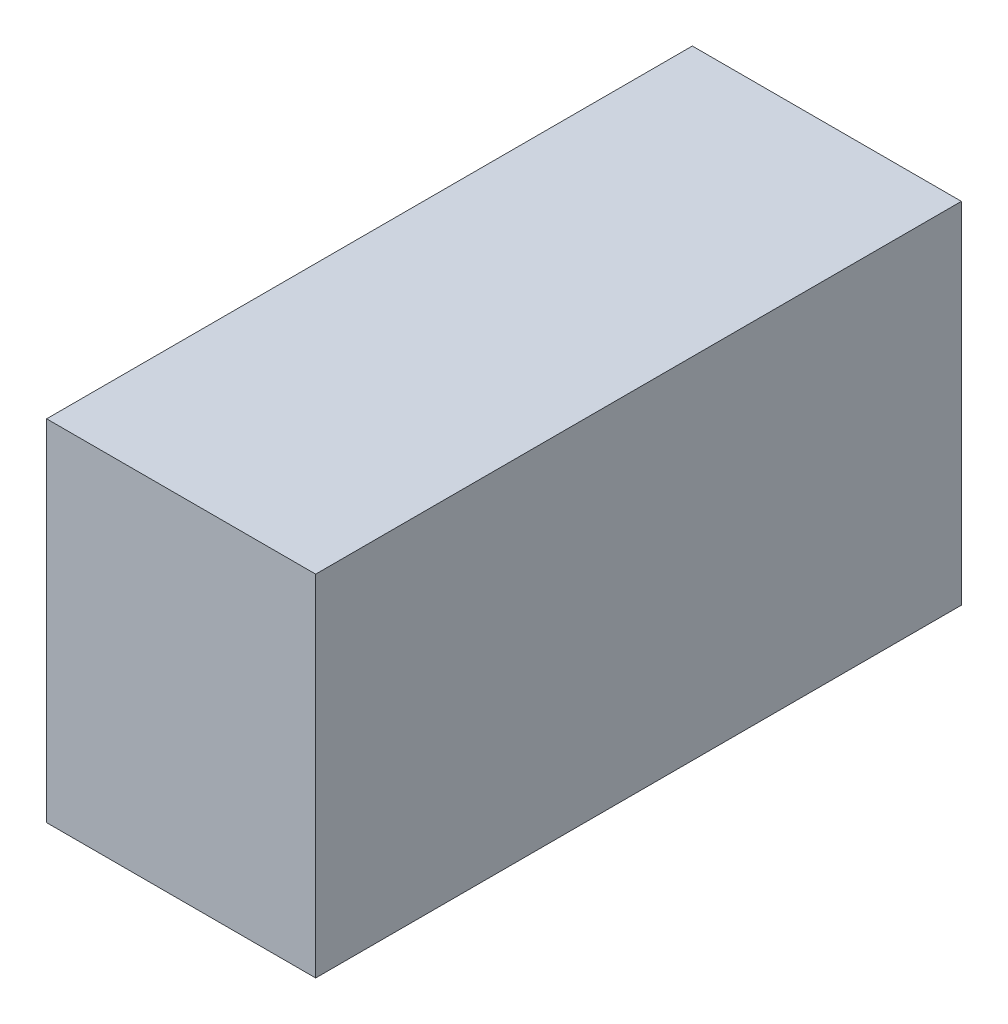
ISO-10303-21;
HEADER;
FILE_DESCRIPTION(('STEP AP214'),'2;1');
FILE_NAME('part.step','',(''),(''),'','','');
FILE_SCHEMA(('AUTOMOTIVE_DESIGN { 1 0 10303 214 1 1 1 1 }'));
ENDSEC;
DATA;
#1=APPLICATION_CONTEXT('core data for automotive mechanical design processes');
#2=APPLICATION_PROTOCOL_DEFINITION('international standard','automotive_design',2000,#1);
#3=PRODUCT_CONTEXT('',#1,'mechanical');
#4=PRODUCT('Part','Part','',(#3));
#5=PRODUCT_RELATED_PRODUCT_CATEGORY('part','',(#4));
#6=PRODUCT_DEFINITION_FORMATION('','',#4);
#7=PRODUCT_DEFINITION_CONTEXT('part definition',#1,'design');
#8=PRODUCT_DEFINITION('design','',#6,#7);
#9=PRODUCT_DEFINITION_SHAPE('','',#8);
#10=(LENGTH_UNIT() NAMED_UNIT(*) SI_UNIT(.MILLI.,.METRE.));
#11=(NAMED_UNIT(*) PLANE_ANGLE_UNIT() SI_UNIT($,.RADIAN.));
#12=(NAMED_UNIT(*) SI_UNIT($,.STERADIAN.) SOLID_ANGLE_UNIT());
#13=UNCERTAINTY_MEASURE_WITH_UNIT(LENGTH_MEASURE(1.E-05),#10,'distance_accuracy_value','');
#14=(GEOMETRIC_REPRESENTATION_CONTEXT(3) GLOBAL_UNCERTAINTY_ASSIGNED_CONTEXT((#13)) GLOBAL_UNIT_ASSIGNED_CONTEXT((#10,
#11,#12)) REPRESENTATION_CONTEXT('',''));
#15=CARTESIAN_POINT('',(0.,0.,0.));
#16=DIRECTION('',(0.,0.,1.));
#17=DIRECTION('',(1.,0.,0.));
#18=AXIS2_PLACEMENT_3D('',#15,#16,#17);
#19=CARTESIAN_POINT('',(0.,16.51,0.));
#20=DIRECTION('',(-1.,0.,0.));
#21=DIRECTION('',(0.,0.,1.));
#22=AXIS2_PLACEMENT_3D('',#19,#20,#21);
#23=PLANE('',#22);
#24=DIRECTION('',(0.,-1.,0.));
#25=VECTOR('',#24,1.);
#26=CARTESIAN_POINT('',(0.,16.51,-24.1299999999999));
#27=LINE('',#26,#25);
#28=CARTESIAN_POINT('',(0.,16.51,-24.1299999999999));
#29=VERTEX_POINT('',#28);
#30=CARTESIAN_POINT('',(0.,0.,-24.1299999999999));
#31=VERTEX_POINT('',#30);
#32=EDGE_CURVE('E56',#29,#31,#27,.T.);
#33=ORIENTED_EDGE('',*,*,#32,.F.);
#34=DIRECTION('',(0.,0.,-1.));
#35=VECTOR('',#34,1.);
#36=CARTESIAN_POINT('',(0.,16.51,0.));
#37=LINE('',#36,#35);
#38=CARTESIAN_POINT('',(0.,16.51,6.35));
#39=VERTEX_POINT('',#38);
#40=EDGE_CURVE('E82',#39,#29,#37,.T.);
#41=ORIENTED_EDGE('',*,*,#40,.F.);
#42=DIRECTION('',(0.,1.,0.));
#43=VECTOR('',#42,1.);
#44=CARTESIAN_POINT('',(0.,16.51,6.35));
#45=LINE('',#44,#43);
#46=CARTESIAN_POINT('',(0.,0.,6.35));
#47=VERTEX_POINT('',#46);
#48=EDGE_CURVE('E91',#47,#39,#45,.T.);
#49=ORIENTED_EDGE('',*,*,#48,.F.);
#50=DIRECTION('',(0.,0.,-1.));
#51=VECTOR('',#50,1.);
#52=CARTESIAN_POINT('',(0.,0.,0.));
#53=LINE('',#52,#51);
#54=EDGE_CURVE('E83',#47,#31,#53,.T.);
#55=ORIENTED_EDGE('',*,*,#54,.T.);
#56=EDGE_LOOP('',(#33,#41,#49,#55));
#57=FACE_BOUND('',#56,.T.);
#58=ADVANCED_FACE('F34',(#57),#23,.F.);
#59=CARTESIAN_POINT('',(-12.7,16.51,0.));
#60=DIRECTION('',(1.,0.,0.));
#61=DIRECTION('',(0.,0.,-1.));
#62=AXIS2_PLACEMENT_3D('',#59,#60,#61);
#63=PLANE('',#62);
#64=DIRECTION('',(0.,1.,0.));
#65=VECTOR('',#64,1.);
#66=CARTESIAN_POINT('',(-12.7,16.51,-24.1299999999999));
#67=LINE('',#66,#65);
#68=CARTESIAN_POINT('',(-12.7,0.,-24.1299999999999));
#69=VERTEX_POINT('',#68);
#70=CARTESIAN_POINT('',(-12.7,16.51,-24.1299999999999));
#71=VERTEX_POINT('',#70);
#72=EDGE_CURVE('E85',#69,#71,#67,.T.);
#73=ORIENTED_EDGE('',*,*,#72,.F.);
#74=DIRECTION('',(0.,0.,1.));
#75=VECTOR('',#74,1.);
#76=CARTESIAN_POINT('',(-12.7,0.,0.));
#77=LINE('',#76,#75);
#78=CARTESIAN_POINT('',(-12.7,0.,6.35));
#79=VERTEX_POINT('',#78);
#80=EDGE_CURVE('E74',#69,#79,#77,.T.);
#81=ORIENTED_EDGE('',*,*,#80,.T.);
#82=DIRECTION('',(0.,-1.,0.));
#83=VECTOR('',#82,1.);
#84=CARTESIAN_POINT('',(-12.7,16.51,6.35));
#85=LINE('',#84,#83);
#86=CARTESIAN_POINT('',(-12.7,16.51,6.35));
#87=VERTEX_POINT('',#86);
#88=EDGE_CURVE('E99',#87,#79,#85,.T.);
#89=ORIENTED_EDGE('',*,*,#88,.F.);
#90=DIRECTION('',(0.,0.,1.));
#91=VECTOR('',#90,1.);
#92=CARTESIAN_POINT('',(-12.7,16.51,0.));
#93=LINE('',#92,#91);
#94=EDGE_CURVE('E41',#71,#87,#93,.T.);
#95=ORIENTED_EDGE('',*,*,#94,.F.);
#96=EDGE_LOOP('',(#73,#81,#89,#95));
#97=FACE_BOUND('',#96,.T.);
#98=ADVANCED_FACE('F86',(#97),#63,.F.);
#99=CARTESIAN_POINT('',(0.,16.51,0.));
#100=DIRECTION('',(0.,1.,0.));
#101=DIRECTION('',(0.,0.,1.));
#102=AXIS2_PLACEMENT_3D('',#99,#100,#101);
#103=PLANE('',#102);
#104=ORIENTED_EDGE('',*,*,#40,.T.);
#105=DIRECTION('',(-1.,0.,0.));
#106=VECTOR('',#105,1.);
#107=CARTESIAN_POINT('',(0.,16.51,-24.1299999999999));
#108=LINE('',#107,#106);
#109=EDGE_CURVE('E48',#29,#71,#108,.T.);
#110=ORIENTED_EDGE('',*,*,#109,.T.);
#111=ORIENTED_EDGE('',*,*,#94,.T.);
#112=DIRECTION('',(-1.,0.,0.));
#113=VECTOR('',#112,1.);
#114=CARTESIAN_POINT('',(0.,16.51,6.35));
#115=LINE('',#114,#113);
#116=EDGE_CURVE('E96',#39,#87,#115,.T.);
#117=ORIENTED_EDGE('',*,*,#116,.F.);
#118=EDGE_LOOP('',(#104,#110,#111,#117));
#119=FACE_BOUND('',#118,.T.);
#120=ADVANCED_FACE('F108',(#119),#103,.T.);
#121=CARTESIAN_POINT('',(0.,0.,0.));
#122=DIRECTION('',(0.,1.,0.));
#123=DIRECTION('',(0.,0.,1.));
#124=AXIS2_PLACEMENT_3D('',#121,#122,#123);
#125=PLANE('',#124);
#126=DIRECTION('',(-1.,0.,0.));
#127=VECTOR('',#126,1.);
#128=CARTESIAN_POINT('',(0.,0.,-24.1299999999999));
#129=LINE('',#128,#127);
#130=EDGE_CURVE('E11',#31,#69,#129,.T.);
#131=ORIENTED_EDGE('',*,*,#130,.F.);
#132=ORIENTED_EDGE('',*,*,#54,.F.);
#133=DIRECTION('',(1.,0.,0.));
#134=VECTOR('',#133,1.);
#135=CARTESIAN_POINT('',(0.,0.,6.35));
#136=LINE('',#135,#134);
#137=EDGE_CURVE('E78',#79,#47,#136,.T.);
#138=ORIENTED_EDGE('',*,*,#137,.F.);
#139=ORIENTED_EDGE('',*,*,#80,.F.);
#140=EDGE_LOOP('',(#131,#132,#138,#139));
#141=FACE_BOUND('',#140,.T.);
#142=ADVANCED_FACE('F76',(#141),#125,.F.);
#143=CARTESIAN_POINT('',(0.,0.,6.35));
#144=DIRECTION('',(0.,0.,-1.));
#145=DIRECTION('',(-1.,0.,0.));
#146=AXIS2_PLACEMENT_3D('',#143,#144,#145);
#147=PLANE('',#146);
#148=ORIENTED_EDGE('',*,*,#48,.T.);
#149=ORIENTED_EDGE('',*,*,#116,.T.);
#150=ORIENTED_EDGE('',*,*,#88,.T.);
#151=ORIENTED_EDGE('',*,*,#137,.T.);
#152=EDGE_LOOP('',(#148,#149,#150,#151));
#153=FACE_BOUND('',#152,.T.);
#154=ADVANCED_FACE('F106',(#153),#147,.F.);
#155=CARTESIAN_POINT('',(-13.312237671813,84.6134845310302,-24.1299999999999));
#156=DIRECTION('',(0.,0.,-1.));
#157=DIRECTION('',(-1.,0.,0.));
#158=AXIS2_PLACEMENT_3D('',#155,#156,#157);
#159=PLANE('',#158);
#160=ORIENTED_EDGE('',*,*,#109,.F.);
#161=ORIENTED_EDGE('',*,*,#32,.T.);
#162=ORIENTED_EDGE('',*,*,#130,.T.);
#163=ORIENTED_EDGE('',*,*,#72,.T.);
#164=EDGE_LOOP('',(#160,#161,#162,#163));
#165=FACE_BOUND('',#164,.T.);
#166=ADVANCED_FACE('F89',(#165),#159,.T.);
#167=CLOSED_SHELL('',(#58,#98,#120,#142,#154,#166));
#168=MANIFOLD_SOLID_BREP('B2',#167);
#169=ADVANCED_BREP_SHAPE_REPRESENTATION('',(#18,#168),#14);
#170=SHAPE_DEFINITION_REPRESENTATION(#9,#169);
ENDSEC;
END-ISO-10303-21;
